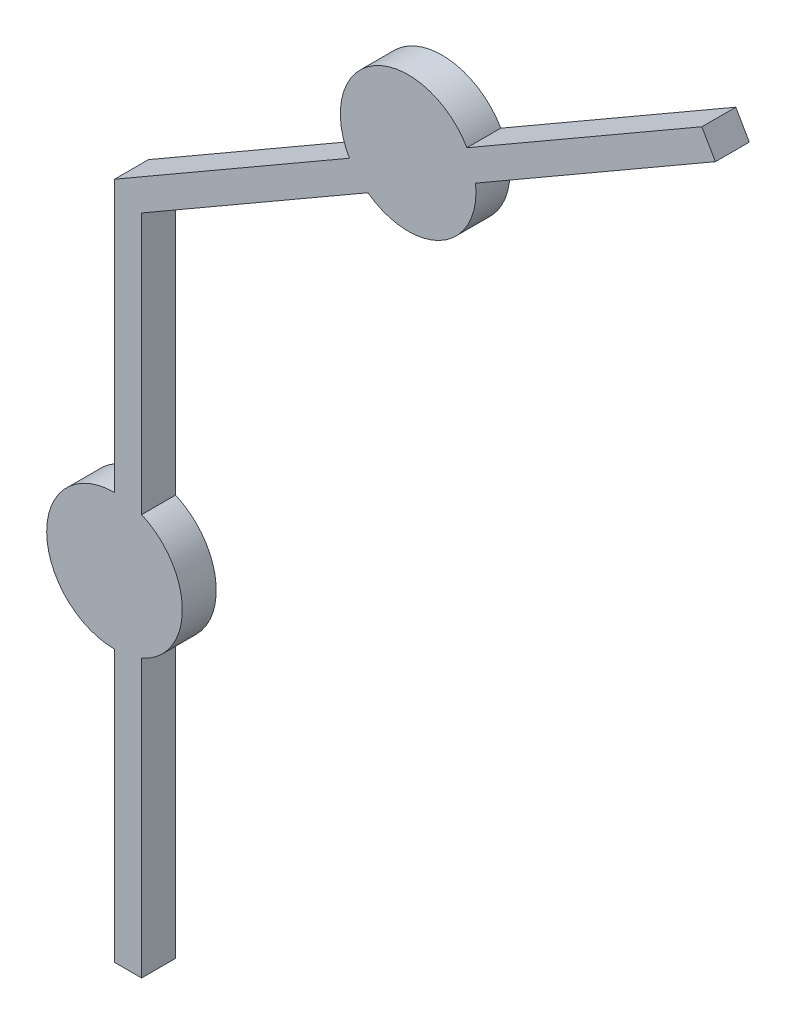
ISO-10303-21;
HEADER;
FILE_DESCRIPTION(('STEP AP214'),'2;1');
FILE_NAME('part.step','',(''),(''),'','','');
FILE_SCHEMA(('AUTOMOTIVE_DESIGN { 1 0 10303 214 1 1 1 1 }'));
ENDSEC;
DATA;
#1=APPLICATION_CONTEXT('core data for automotive mechanical design processes');
#2=APPLICATION_PROTOCOL_DEFINITION('international standard','automotive_design',2000,#1);
#3=PRODUCT_CONTEXT('',#1,'mechanical');
#4=PRODUCT('Part','Part','',(#3));
#5=PRODUCT_RELATED_PRODUCT_CATEGORY('part','',(#4));
#6=PRODUCT_DEFINITION_FORMATION('','',#4);
#7=PRODUCT_DEFINITION_CONTEXT('part definition',#1,'design');
#8=PRODUCT_DEFINITION('design','',#6,#7);
#9=PRODUCT_DEFINITION_SHAPE('','',#8);
#10=(LENGTH_UNIT() NAMED_UNIT(*) SI_UNIT(.MILLI.,.METRE.));
#11=(NAMED_UNIT(*) PLANE_ANGLE_UNIT() SI_UNIT($,.RADIAN.));
#12=(NAMED_UNIT(*) SI_UNIT($,.STERADIAN.) SOLID_ANGLE_UNIT());
#13=UNCERTAINTY_MEASURE_WITH_UNIT(LENGTH_MEASURE(1.E-05),#10,'distance_accuracy_value','');
#14=(GEOMETRIC_REPRESENTATION_CONTEXT(3) GLOBAL_UNCERTAINTY_ASSIGNED_CONTEXT((#13)) GLOBAL_UNIT_ASSIGNED_CONTEXT((#10,
#11,#12)) REPRESENTATION_CONTEXT('',''));
#15=CARTESIAN_POINT('',(0.,0.,0.));
#16=DIRECTION('',(0.,0.,1.));
#17=DIRECTION('',(1.,0.,0.));
#18=AXIS2_PLACEMENT_3D('',#15,#16,#17);
#19=CARTESIAN_POINT('',(0.,0.,1.5));
#20=DIRECTION('',(-1.,0.,0.));
#21=DIRECTION('',(0.,0.,1.));
#22=AXIS2_PLACEMENT_3D('',#19,#20,#21);
#23=PLANE('',#22);
#24=DIRECTION('',(0.,1.,0.));
#25=VECTOR('',#24,1.);
#26=CARTESIAN_POINT('',(0.,0.,0.));
#27=LINE('',#26,#25);
#28=CARTESIAN_POINT('',(0.,18.,0.));
#29=VERTEX_POINT('',#28);
#30=CARTESIAN_POINT('',(0.,30.,0.));
#31=VERTEX_POINT('',#30);
#32=EDGE_CURVE('E146',#29,#31,#27,.T.);
#33=ORIENTED_EDGE('',*,*,#32,.F.);
#34=DIRECTION('',(0.,0.,-1.));
#35=VECTOR('',#34,1.);
#36=CARTESIAN_POINT('',(0.,18.,9.98528137423858));
#37=LINE('',#36,#35);
#38=CARTESIAN_POINT('',(0.,18.,1.5));
#39=VERTEX_POINT('',#38);
#40=EDGE_CURVE('E145',#29,#39,#37,.F.);
#41=ORIENTED_EDGE('',*,*,#40,.T.);
#42=DIRECTION('',(0.,1.,0.));
#43=VECTOR('',#42,1.);
#44=CARTESIAN_POINT('',(0.,0.,1.5));
#45=LINE('',#44,#43);
#46=CARTESIAN_POINT('',(0.,30.,1.5));
#47=VERTEX_POINT('',#46);
#48=EDGE_CURVE('E133',#39,#47,#45,.T.);
#49=ORIENTED_EDGE('',*,*,#48,.T.);
#50=DIRECTION('',(0.,0.,-1.));
#51=VECTOR('',#50,1.);
#52=CARTESIAN_POINT('',(0.,30.,1.5));
#53=LINE('',#52,#51);
#54=EDGE_CURVE('E223',#47,#31,#53,.T.);
#55=ORIENTED_EDGE('',*,*,#54,.T.);
#56=EDGE_LOOP('',(#33,#41,#49,#55));
#57=FACE_BOUND('',#56,.T.);
#58=ADVANCED_FACE('F33',(#57),#23,.T.);
#59=CARTESIAN_POINT('',(0.,0.,1.5));
#60=VERTEX_POINT('',#59);
#61=CARTESIAN_POINT('',(0.,12.,1.5));
#62=VERTEX_POINT('',#61);
#63=EDGE_CURVE('E56',#60,#62,#45,.T.);
#64=ORIENTED_EDGE('',*,*,#63,.T.);
#65=DIRECTION('',(0.,0.,-1.));
#66=VECTOR('',#65,1.);
#67=CARTESIAN_POINT('',(0.,12.,9.98528137423858));
#68=LINE('',#67,#66);
#69=CARTESIAN_POINT('',(0.,12.,0.));
#70=VERTEX_POINT('',#69);
#71=EDGE_CURVE('E151',#62,#70,#68,.T.);
#72=ORIENTED_EDGE('',*,*,#71,.T.);
#73=CARTESIAN_POINT('',(0.,0.,0.));
#74=VERTEX_POINT('',#73);
#75=EDGE_CURVE('E207',#74,#70,#27,.T.);
#76=ORIENTED_EDGE('',*,*,#75,.F.);
#77=DIRECTION('',(0.,0.,-1.));
#78=VECTOR('',#77,1.);
#79=CARTESIAN_POINT('',(0.,0.,1.5));
#80=LINE('',#79,#78);
#81=EDGE_CURVE('E221',#60,#74,#80,.T.);
#82=ORIENTED_EDGE('',*,*,#81,.F.);
#83=EDGE_LOOP('',(#64,#72,#76,#82));
#84=FACE_BOUND('',#83,.T.);
#85=ADVANCED_FACE('F272',(#84),#23,.T.);
#86=CARTESIAN_POINT('',(1.2,0.,1.5));
#87=DIRECTION('',(-1.,0.,0.));
#88=DIRECTION('',(0.,0.,1.));
#89=AXIS2_PLACEMENT_3D('',#86,#87,#88);
#90=PLANE('',#89);
#91=DIRECTION('',(0.,0.,-1.));
#92=VECTOR('',#91,1.);
#93=CARTESIAN_POINT('',(1.2,17.7495454169735,9.98528137423858));
#94=LINE('',#93,#92);
#95=CARTESIAN_POINT('',(1.2,17.7495454169735,0.));
#96=VERTEX_POINT('',#95);
#97=CARTESIAN_POINT('',(1.2,17.7495454169735,1.5));
#98=VERTEX_POINT('',#97);
#99=EDGE_CURVE('E161',#96,#98,#94,.F.);
#100=ORIENTED_EDGE('',*,*,#99,.F.);
#101=DIRECTION('',(0.,1.,0.));
#102=VECTOR('',#101,1.);
#103=CARTESIAN_POINT('',(1.2,0.,0.));
#104=LINE('',#103,#102);
#105=CARTESIAN_POINT('',(1.2,29.3071796769724,0.));
#106=VERTEX_POINT('',#105);
#107=EDGE_CURVE('E213',#96,#106,#104,.T.);
#108=ORIENTED_EDGE('',*,*,#107,.T.);
#109=DIRECTION('',(0.,0.,-1.));
#110=VECTOR('',#109,1.);
#111=CARTESIAN_POINT('',(1.2,29.3071796769724,1.5));
#112=LINE('',#111,#110);
#113=CARTESIAN_POINT('',(1.2,29.3071796769724,1.5));
#114=VERTEX_POINT('',#113);
#115=EDGE_CURVE('E196',#114,#106,#112,.T.);
#116=ORIENTED_EDGE('',*,*,#115,.F.);
#117=DIRECTION('',(0.,1.,0.));
#118=VECTOR('',#117,1.);
#119=CARTESIAN_POINT('',(1.2,0.,1.5));
#120=LINE('',#119,#118);
#121=EDGE_CURVE('E193',#98,#114,#120,.T.);
#122=ORIENTED_EDGE('',*,*,#121,.F.);
#123=EDGE_LOOP('',(#100,#108,#116,#122));
#124=FACE_BOUND('',#123,.T.);
#125=ADVANCED_FACE('F259',(#124),#90,.F.);
#126=DIRECTION('',(0.,0.,-1.));
#127=VECTOR('',#126,1.);
#128=CARTESIAN_POINT('',(1.2,12.2504545830265,9.98528137423858));
#129=LINE('',#128,#127);
#130=CARTESIAN_POINT('',(1.2,12.2504545830265,1.5));
#131=VERTEX_POINT('',#130);
#132=CARTESIAN_POINT('',(1.2,12.2504545830265,0.));
#133=VERTEX_POINT('',#132);
#134=EDGE_CURVE('E156',#131,#133,#129,.T.);
#135=ORIENTED_EDGE('',*,*,#134,.F.);
#136=CARTESIAN_POINT('',(1.2,0.,1.5));
#137=VERTEX_POINT('',#136);
#138=EDGE_CURVE('E194',#137,#131,#120,.T.);
#139=ORIENTED_EDGE('',*,*,#138,.F.);
#140=DIRECTION('',(0.,0.,-1.));
#141=VECTOR('',#140,1.);
#142=CARTESIAN_POINT('',(1.2,0.,1.5));
#143=LINE('',#142,#141);
#144=CARTESIAN_POINT('',(1.2,0.,0.));
#145=VERTEX_POINT('',#144);
#146=EDGE_CURVE('E219',#137,#145,#143,.T.);
#147=ORIENTED_EDGE('',*,*,#146,.T.);
#148=EDGE_CURVE('E214',#145,#133,#104,.T.);
#149=ORIENTED_EDGE('',*,*,#148,.T.);
#150=EDGE_LOOP('',(#135,#139,#147,#149));
#151=FACE_BOUND('',#150,.T.);
#152=ADVANCED_FACE('F266',(#151),#90,.F.);
#153=CARTESIAN_POINT('',(0.599999999999998,28.9607695154587,1.5));
#154=DIRECTION('',(-0.499999999999998,0.86602540378444,0.));
#155=DIRECTION('',(-0.86602540378444,-0.499999999999998,0.));
#156=AXIS2_PLACEMENT_3D('',#153,#154,#155);
#157=PLANE('',#156);
#158=DIRECTION('',(0.,0.,-1.));
#159=VECTOR('',#158,1.);
#160=CARTESIAN_POINT('',(15.9715572367247,37.8355422239454,9.98528137423858));
#161=LINE('',#160,#159);
#162=CARTESIAN_POINT('',(15.9715572367247,37.8355422239454,0.));
#163=VERTEX_POINT('',#162);
#164=CARTESIAN_POINT('',(15.9715572367247,37.8355422239454,1.5));
#165=VERTEX_POINT('',#164);
#166=EDGE_CURVE('E177',#163,#165,#161,.F.);
#167=ORIENTED_EDGE('',*,*,#166,.F.);
#168=DIRECTION('',(0.86602540378444,0.499999999999998,0.));
#169=VECTOR('',#168,1.);
#170=CARTESIAN_POINT('',(0.599999999999998,28.9607695154587,0.));
#171=LINE('',#170,#169);
#172=CARTESIAN_POINT('',(26.5807621135332,43.9607695154586,0.));
#173=VERTEX_POINT('',#172);
#174=EDGE_CURVE('E180',#163,#173,#171,.T.);
#175=ORIENTED_EDGE('',*,*,#174,.T.);
#176=DIRECTION('',(0.,0.,-1.));
#177=VECTOR('',#176,1.);
#178=CARTESIAN_POINT('',(26.5807621135332,43.9607695154586,1.5));
#179=LINE('',#178,#177);
#180=CARTESIAN_POINT('',(26.5807621135332,43.9607695154586,1.5));
#181=VERTEX_POINT('',#180);
#182=EDGE_CURVE('E11',#181,#173,#179,.T.);
#183=ORIENTED_EDGE('',*,*,#182,.F.);
#184=DIRECTION('',(0.86602540378444,0.499999999999998,0.));
#185=VECTOR('',#184,1.);
#186=CARTESIAN_POINT('',(0.599999999999998,28.9607695154587,1.5));
#187=LINE('',#186,#185);
#188=EDGE_CURVE('E185',#165,#181,#187,.T.);
#189=ORIENTED_EDGE('',*,*,#188,.F.);
#190=EDGE_LOOP('',(#167,#175,#183,#189));
#191=FACE_BOUND('',#190,.T.);
#192=ADVANCED_FACE('F35',(#191),#157,.F.);
#193=DIRECTION('',(0.,0.,-1.));
#194=VECTOR('',#193,1.);
#195=CARTESIAN_POINT('',(11.2092048768085,35.0859968069719,9.98528137423858));
#196=LINE('',#195,#194);
#197=CARTESIAN_POINT('',(11.2092048768085,35.0859968069719,1.5));
#198=VERTEX_POINT('',#197);
#199=CARTESIAN_POINT('',(11.2092048768085,35.0859968069719,0.));
#200=VERTEX_POINT('',#199);
#201=EDGE_CURVE('E175',#198,#200,#196,.T.);
#202=ORIENTED_EDGE('',*,*,#201,.F.);
#203=EDGE_CURVE('E181',#114,#198,#187,.T.);
#204=ORIENTED_EDGE('',*,*,#203,.F.);
#205=ORIENTED_EDGE('',*,*,#115,.T.);
#206=EDGE_CURVE('E197',#106,#200,#171,.T.);
#207=ORIENTED_EDGE('',*,*,#206,.T.);
#208=EDGE_LOOP('',(#202,#204,#205,#207));
#209=FACE_BOUND('',#208,.T.);
#210=ADVANCED_FACE('F253',(#209),#157,.F.);
#211=CARTESIAN_POINT('',(0.,30.,1.5));
#212=DIRECTION('',(-0.499999999999998,0.86602540378444,0.));
#213=DIRECTION('',(-0.86602540378444,-0.499999999999998,0.));
#214=AXIS2_PLACEMENT_3D('',#211,#212,#213);
#215=PLANE('',#214);
#216=DIRECTION('',(0.86602540378444,0.499999999999998,0.));
#217=VECTOR('',#216,1.);
#218=CARTESIAN_POINT('',(0.,30.,0.));
#219=LINE('',#218,#217);
#220=CARTESIAN_POINT('',(15.5884572681199,39.,0.));
#221=VERTEX_POINT('',#220);
#222=CARTESIAN_POINT('',(25.9807621135332,44.9999999999999,0.));
#223=VERTEX_POINT('',#222);
#224=EDGE_CURVE('E203',#221,#223,#219,.T.);
#225=ORIENTED_EDGE('',*,*,#224,.F.);
#226=DIRECTION('',(0.,0.,-1.));
#227=VECTOR('',#226,1.);
#228=CARTESIAN_POINT('',(15.5884572681199,39.,9.98528137423858));
#229=LINE('',#228,#227);
#230=CARTESIAN_POINT('',(15.5884572681199,39.,1.5));
#231=VERTEX_POINT('',#230);
#232=EDGE_CURVE('E172',#221,#231,#229,.F.);
#233=ORIENTED_EDGE('',*,*,#232,.T.);
#234=DIRECTION('',(0.86602540378444,0.499999999999998,0.));
#235=VECTOR('',#234,1.);
#236=CARTESIAN_POINT('',(0.,30.,1.5));
#237=LINE('',#236,#235);
#238=CARTESIAN_POINT('',(25.9807621135332,44.9999999999999,1.5));
#239=VERTEX_POINT('',#238);
#240=EDGE_CURVE('E188',#231,#239,#237,.T.);
#241=ORIENTED_EDGE('',*,*,#240,.T.);
#242=DIRECTION('',(0.,0.,-1.));
#243=VECTOR('',#242,1.);
#244=CARTESIAN_POINT('',(25.9807621135332,44.9999999999999,1.5));
#245=LINE('',#244,#243);
#246=EDGE_CURVE('E41',#239,#223,#245,.T.);
#247=ORIENTED_EDGE('',*,*,#246,.T.);
#248=EDGE_LOOP('',(#225,#233,#241,#247));
#249=FACE_BOUND('',#248,.T.);
#250=ADVANCED_FACE('F228',(#249),#215,.T.);
#251=CARTESIAN_POINT('',(10.3923048454133,36.,1.5));
#252=VERTEX_POINT('',#251);
#253=EDGE_CURVE('E139',#47,#252,#237,.T.);
#254=ORIENTED_EDGE('',*,*,#253,.T.);
#255=DIRECTION('',(0.,0.,-1.));
#256=VECTOR('',#255,1.);
#257=CARTESIAN_POINT('',(10.3923048454133,36.,9.98528137423858));
#258=LINE('',#257,#256);
#259=CARTESIAN_POINT('',(10.3923048454133,36.,0.));
#260=VERTEX_POINT('',#259);
#261=EDGE_CURVE('E170',#252,#260,#258,.T.);
#262=ORIENTED_EDGE('',*,*,#261,.T.);
#263=EDGE_CURVE('E204',#31,#260,#219,.T.);
#264=ORIENTED_EDGE('',*,*,#263,.F.);
#265=ORIENTED_EDGE('',*,*,#54,.F.);
#266=EDGE_LOOP('',(#254,#262,#264,#265));
#267=FACE_BOUND('',#266,.T.);
#268=ADVANCED_FACE('F283',(#267),#215,.T.);
#269=CARTESIAN_POINT('',(25.9807621135332,44.9999999999999,1.5));
#270=DIRECTION('',(0.866025403784437,0.500000000000003,0.));
#271=DIRECTION('',(-0.500000000000003,0.866025403784437,0.));
#272=AXIS2_PLACEMENT_3D('',#269,#270,#271);
#273=PLANE('',#272);
#274=DIRECTION('',(0.500000000000003,-0.866025403784437,0.));
#275=VECTOR('',#274,1.);
#276=CARTESIAN_POINT('',(25.9807621135332,44.9999999999999,0.));
#277=LINE('',#276,#275);
#278=EDGE_CURVE('E200',#223,#173,#277,.T.);
#279=ORIENTED_EDGE('',*,*,#278,.F.);
#280=ORIENTED_EDGE('',*,*,#246,.F.);
#281=DIRECTION('',(0.500000000000003,-0.866025403784437,0.));
#282=VECTOR('',#281,1.);
#283=CARTESIAN_POINT('',(25.9807621135332,44.9999999999999,1.5));
#284=LINE('',#283,#282);
#285=EDGE_CURVE('E184',#239,#181,#284,.T.);
#286=ORIENTED_EDGE('',*,*,#285,.T.);
#287=ORIENTED_EDGE('',*,*,#182,.T.);
#288=EDGE_LOOP('',(#279,#280,#286,#287));
#289=FACE_BOUND('',#288,.T.);
#290=ADVANCED_FACE('F232',(#289),#273,.T.);
#291=CARTESIAN_POINT('',(1.2,0.,1.5));
#292=DIRECTION('',(0.,-1.,0.));
#293=DIRECTION('',(0.,0.,-1.));
#294=AXIS2_PLACEMENT_3D('',#291,#292,#293);
#295=PLANE('',#294);
#296=DIRECTION('',(-1.,0.,0.));
#297=VECTOR('',#296,1.);
#298=CARTESIAN_POINT('',(1.2,0.,0.));
#299=LINE('',#298,#297);
#300=EDGE_CURVE('E210',#145,#74,#299,.T.);
#301=ORIENTED_EDGE('',*,*,#300,.F.);
#302=ORIENTED_EDGE('',*,*,#146,.F.);
#303=DIRECTION('',(-1.,0.,0.));
#304=VECTOR('',#303,1.);
#305=CARTESIAN_POINT('',(1.2,0.,1.5));
#306=LINE('',#305,#304);
#307=EDGE_CURVE('E190',#137,#60,#306,.T.);
#308=ORIENTED_EDGE('',*,*,#307,.T.);
#309=ORIENTED_EDGE('',*,*,#81,.T.);
#310=EDGE_LOOP('',(#301,#302,#308,#309));
#311=FACE_BOUND('',#310,.T.);
#312=ADVANCED_FACE('F270',(#311),#295,.T.);
#313=CARTESIAN_POINT('',(0.,0.,1.5));
#314=DIRECTION('',(0.,0.,-1.));
#315=DIRECTION('',(-1.,0.,0.));
#316=AXIS2_PLACEMENT_3D('',#313,#314,#315);
#317=PLANE('',#316);
#318=ORIENTED_EDGE('',*,*,#48,.F.);
#319=CARTESIAN_POINT('',(0.,15.,1.5));
#320=DIRECTION('',(0.,0.,-1.));
#321=DIRECTION('',(-1.,0.,0.));
#322=AXIS2_PLACEMENT_3D('',#319,#320,#321);
#323=CIRCLE('',#322,3.);
#324=EDGE_CURVE('E137',#62,#39,#323,.T.);
#325=ORIENTED_EDGE('',*,*,#324,.F.);
#326=ORIENTED_EDGE('',*,*,#63,.F.);
#327=ORIENTED_EDGE('',*,*,#307,.F.);
#328=ORIENTED_EDGE('',*,*,#138,.T.);
#329=EDGE_CURVE('E48',#98,#131,#323,.T.);
#330=ORIENTED_EDGE('',*,*,#329,.F.);
#331=ORIENTED_EDGE('',*,*,#121,.T.);
#332=ORIENTED_EDGE('',*,*,#203,.T.);
#333=CARTESIAN_POINT('',(12.9903810567666,37.5,1.5));
#334=DIRECTION('',(0.,0.,-1.));
#335=DIRECTION('',(-1.,0.,0.));
#336=AXIS2_PLACEMENT_3D('',#333,#334,#335);
#337=CIRCLE('',#336,3.);
#338=EDGE_CURVE('E169',#165,#198,#337,.T.);
#339=ORIENTED_EDGE('',*,*,#338,.F.);
#340=ORIENTED_EDGE('',*,*,#188,.T.);
#341=ORIENTED_EDGE('',*,*,#285,.F.);
#342=ORIENTED_EDGE('',*,*,#240,.F.);
#343=EDGE_CURVE('E166',#252,#231,#337,.T.);
#344=ORIENTED_EDGE('',*,*,#343,.F.);
#345=ORIENTED_EDGE('',*,*,#253,.F.);
#346=EDGE_LOOP('',(#318,#325,#326,#327,#328,#330,#331,#332,#339,#340,#341,#342,#344,#345));
#347=FACE_BOUND('',#346,.T.);
#348=ADVANCED_FACE('F135',(#347),#317,.F.);
#349=CARTESIAN_POINT('',(0.,0.,0.));
#350=DIRECTION('',(0.,0.,-1.));
#351=DIRECTION('',(-1.,0.,0.));
#352=AXIS2_PLACEMENT_3D('',#349,#350,#351);
#353=PLANE('',#352);
#354=ORIENTED_EDGE('',*,*,#107,.F.);
#355=CARTESIAN_POINT('',(0.,15.,0.));
#356=DIRECTION('',(0.,0.,1.));
#357=DIRECTION('',(1.,0.,0.));
#358=AXIS2_PLACEMENT_3D('',#355,#356,#357);
#359=CIRCLE('',#358,3.);
#360=EDGE_CURVE('E157',#133,#96,#359,.T.);
#361=ORIENTED_EDGE('',*,*,#360,.F.);
#362=ORIENTED_EDGE('',*,*,#148,.F.);
#363=ORIENTED_EDGE('',*,*,#300,.T.);
#364=ORIENTED_EDGE('',*,*,#75,.T.);
#365=EDGE_CURVE('E154',#29,#70,#359,.T.);
#366=ORIENTED_EDGE('',*,*,#365,.F.);
#367=ORIENTED_EDGE('',*,*,#32,.T.);
#368=ORIENTED_EDGE('',*,*,#263,.T.);
#369=CARTESIAN_POINT('',(12.9903810567666,37.5,0.));
#370=DIRECTION('',(0.,0.,1.));
#371=DIRECTION('',(1.,0.,0.));
#372=AXIS2_PLACEMENT_3D('',#369,#370,#371);
#373=CIRCLE('',#372,3.);
#374=EDGE_CURVE('E165',#221,#260,#373,.T.);
#375=ORIENTED_EDGE('',*,*,#374,.F.);
#376=ORIENTED_EDGE('',*,*,#224,.T.);
#377=ORIENTED_EDGE('',*,*,#278,.T.);
#378=ORIENTED_EDGE('',*,*,#174,.F.);
#379=EDGE_CURVE('E150',#200,#163,#373,.T.);
#380=ORIENTED_EDGE('',*,*,#379,.F.);
#381=ORIENTED_EDGE('',*,*,#206,.F.);
#382=EDGE_LOOP('',(#354,#361,#362,#363,#364,#366,#367,#368,#375,#376,#377,#378,#380,#381));
#383=FACE_BOUND('',#382,.T.);
#384=ADVANCED_FACE('F237',(#383),#353,.T.);
#385=CARTESIAN_POINT('',(12.9903810567666,37.5,9.98528137423858));
#386=DIRECTION('',(0.,0.,-1.));
#387=DIRECTION('',(-1.,0.,0.));
#388=AXIS2_PLACEMENT_3D('',#385,#386,#387);
#389=CYLINDRICAL_SURFACE('',#388,3.);
#390=ORIENTED_EDGE('',*,*,#232,.F.);
#391=ORIENTED_EDGE('',*,*,#374,.T.);
#392=ORIENTED_EDGE('',*,*,#261,.F.);
#393=ORIENTED_EDGE('',*,*,#343,.T.);
#394=EDGE_LOOP('',(#390,#391,#392,#393));
#395=FACE_BOUND('',#394,.T.);
#396=ADVANCED_FACE('F244',(#395),#389,.T.);
#397=ORIENTED_EDGE('',*,*,#379,.T.);
#398=ORIENTED_EDGE('',*,*,#166,.T.);
#399=ORIENTED_EDGE('',*,*,#338,.T.);
#400=ORIENTED_EDGE('',*,*,#201,.T.);
#401=EDGE_LOOP('',(#397,#398,#399,#400));
#402=FACE_BOUND('',#401,.T.);
#403=ADVANCED_FACE('F249',(#402),#389,.T.);
#404=CARTESIAN_POINT('',(0.,15.,9.98528137423858));
#405=DIRECTION('',(0.,0.,-1.));
#406=DIRECTION('',(-1.,0.,0.));
#407=AXIS2_PLACEMENT_3D('',#404,#405,#406);
#408=CYLINDRICAL_SURFACE('',#407,3.);
#409=ORIENTED_EDGE('',*,*,#360,.T.);
#410=ORIENTED_EDGE('',*,*,#99,.T.);
#411=ORIENTED_EDGE('',*,*,#329,.T.);
#412=ORIENTED_EDGE('',*,*,#134,.T.);
#413=EDGE_LOOP('',(#409,#410,#411,#412));
#414=FACE_BOUND('',#413,.T.);
#415=ADVANCED_FACE('F331',(#414),#408,.T.);
#416=ORIENTED_EDGE('',*,*,#40,.F.);
#417=ORIENTED_EDGE('',*,*,#365,.T.);
#418=ORIENTED_EDGE('',*,*,#71,.F.);
#419=ORIENTED_EDGE('',*,*,#324,.T.);
#420=EDGE_LOOP('',(#416,#417,#418,#419));
#421=FACE_BOUND('',#420,.T.);
#422=ADVANCED_FACE('F153',(#421),#408,.T.);
#423=CLOSED_SHELL('',(#58,#85,#125,#152,#192,#210,#250,#268,#290,#312,#348,#384,#396,#403,#415,#422));
#424=MANIFOLD_SOLID_BREP('B2',#423);
#425=ADVANCED_BREP_SHAPE_REPRESENTATION('',(#18,#424),#14);
#426=SHAPE_DEFINITION_REPRESENTATION(#9,#425);
ENDSEC;
END-ISO-10303-21;
